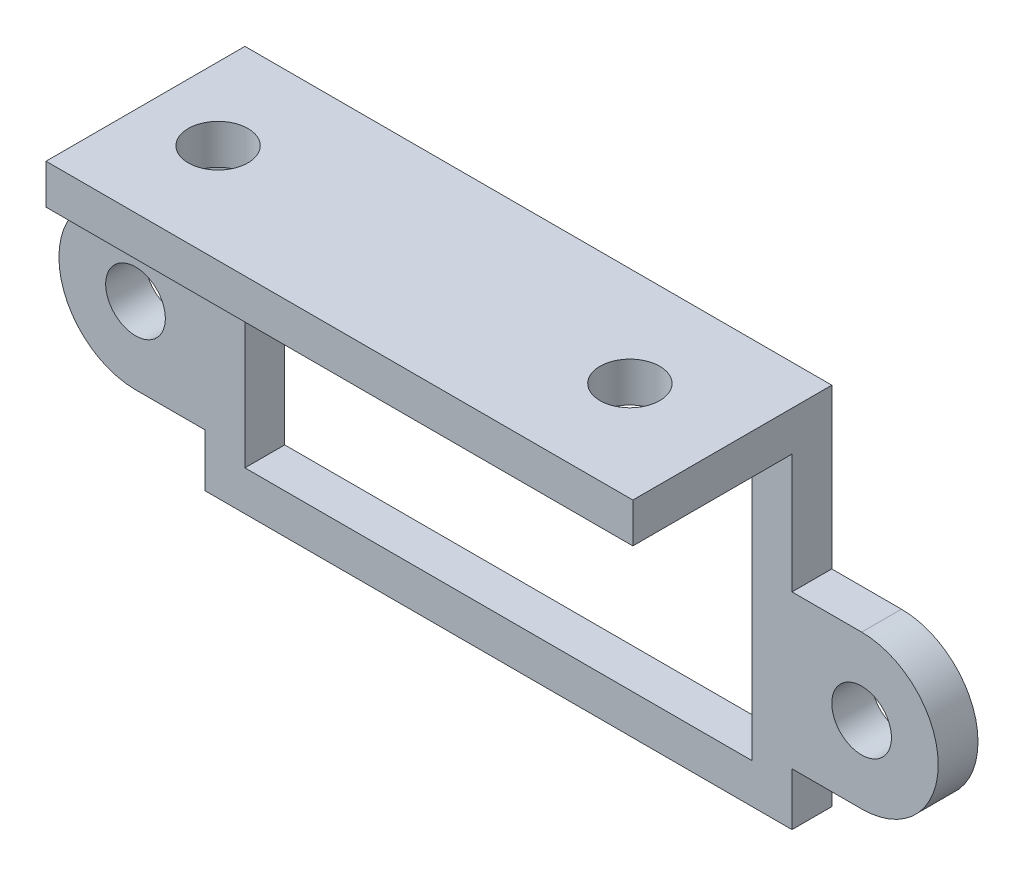
ISO-10303-21;
HEADER;
FILE_DESCRIPTION(('STEP AP214'),'2;1');
FILE_NAME('part.step','',(''),(''),'','','');
FILE_SCHEMA(('AUTOMOTIVE_DESIGN { 1 0 10303 214 1 1 1 1 }'));
ENDSEC;
DATA;
#1=APPLICATION_CONTEXT('core data for automotive mechanical design processes');
#2=APPLICATION_PROTOCOL_DEFINITION('international standard','automotive_design',2000,#1);
#3=PRODUCT_CONTEXT('',#1,'mechanical');
#4=PRODUCT('Part','Part','',(#3));
#5=PRODUCT_RELATED_PRODUCT_CATEGORY('part','',(#4));
#6=PRODUCT_DEFINITION_FORMATION('','',#4);
#7=PRODUCT_DEFINITION_CONTEXT('part definition',#1,'design');
#8=PRODUCT_DEFINITION('design','',#6,#7);
#9=PRODUCT_DEFINITION_SHAPE('','',#8);
#10=(LENGTH_UNIT() NAMED_UNIT(*) SI_UNIT(.MILLI.,.METRE.));
#11=(NAMED_UNIT(*) PLANE_ANGLE_UNIT() SI_UNIT($,.RADIAN.));
#12=(NAMED_UNIT(*) SI_UNIT($,.STERADIAN.) SOLID_ANGLE_UNIT());
#13=UNCERTAINTY_MEASURE_WITH_UNIT(LENGTH_MEASURE(1.E-05),#10,'distance_accuracy_value','');
#14=(GEOMETRIC_REPRESENTATION_CONTEXT(3) GLOBAL_UNCERTAINTY_ASSIGNED_CONTEXT((#13)) GLOBAL_UNIT_ASSIGNED_CONTEXT((#10,
#11,#12)) REPRESENTATION_CONTEXT('',''));
#15=CARTESIAN_POINT('',(0.,0.,0.));
#16=DIRECTION('',(0.,0.,1.));
#17=DIRECTION('',(1.,0.,0.));
#18=AXIS2_PLACEMENT_3D('',#15,#16,#17);
#19=CARTESIAN_POINT('',(33.,6.50000000000002,2.));
#20=DIRECTION('',(0.,0.,-1.));
#21=DIRECTION('',(-1.,0.,0.));
#22=AXIS2_PLACEMENT_3D('',#19,#20,#21);
#23=PLANE('',#22);
#24=CARTESIAN_POINT('',(-3.5,6.5,2.));
#25=DIRECTION('',(0.,0.,1.));
#26=DIRECTION('',(1.,0.,0.));
#27=AXIS2_PLACEMENT_3D('',#24,#25,#26);
#28=CIRCLE('',#27,1.5);
#29=CARTESIAN_POINT('',(-2.,6.5,2.));
#30=VERTEX_POINT('',#29);
#31=EDGE_CURVE('E260',#30,#30,#28,.T.);
#32=ORIENTED_EDGE('',*,*,#31,.F.);
#33=EDGE_LOOP('',(#32));
#34=FACE_BOUND('',#33,.T.);
#35=CARTESIAN_POINT('',(33.,6.50000000000002,2.));
#36=DIRECTION('',(0.,0.,1.));
#37=DIRECTION('',(-1.,0.,0.));
#38=AXIS2_PLACEMENT_3D('',#35,#36,#37);
#39=CIRCLE('',#38,1.5);
#40=CARTESIAN_POINT('',(31.5,6.50000000000002,2.));
#41=VERTEX_POINT('',#40);
#42=EDGE_CURVE('E254',#41,#41,#39,.T.);
#43=ORIENTED_EDGE('',*,*,#42,.F.);
#44=EDGE_LOOP('',(#43));
#45=FACE_BOUND('',#44,.T.);
#46=DIRECTION('',(1.,0.,0.));
#47=VECTOR('',#46,1.);
#48=CARTESIAN_POINT('',(0.,16.35,2.));
#49=LINE('',#48,#47);
#50=CARTESIAN_POINT('',(0.,16.35,2.));
#51=VERTEX_POINT('',#50);
#52=CARTESIAN_POINT('',(2.,16.35,2.));
#53=VERTEX_POINT('',#52);
#54=EDGE_CURVE('E52',#51,#53,#49,.T.);
#55=ORIENTED_EDGE('',*,*,#54,.F.);
#56=DIRECTION('',(0.,-1.,0.));
#57=VECTOR('',#56,1.);
#58=CARTESIAN_POINT('',(0.,18.35,2.));
#59=LINE('',#58,#57);
#60=CARTESIAN_POINT('',(0.,10.35,2.));
#61=VERTEX_POINT('',#60);
#62=EDGE_CURVE('E185',#51,#61,#59,.T.);
#63=ORIENTED_EDGE('',*,*,#62,.T.);
#64=DIRECTION('',(-1.,0.,0.));
#65=VECTOR('',#64,1.);
#66=CARTESIAN_POINT('',(0.,10.35,2.));
#67=LINE('',#66,#65);
#68=CARTESIAN_POINT('',(-3.5,10.35,2.));
#69=VERTEX_POINT('',#68);
#70=EDGE_CURVE('E345',#61,#69,#67,.T.);
#71=ORIENTED_EDGE('',*,*,#70,.T.);
#72=CARTESIAN_POINT('',(-3.5,6.5,2.));
#73=DIRECTION('',(0.,0.,1.));
#74=DIRECTION('',(1.,0.,0.));
#75=AXIS2_PLACEMENT_3D('',#72,#73,#74);
#76=CIRCLE('',#75,3.85);
#77=CARTESIAN_POINT('',(-3.5,2.65,2.));
#78=VERTEX_POINT('',#77);
#79=EDGE_CURVE('E344',#69,#78,#76,.T.);
#80=ORIENTED_EDGE('',*,*,#79,.T.);
#81=DIRECTION('',(1.,0.,0.));
#82=VECTOR('',#81,1.);
#83=CARTESIAN_POINT('',(0.,2.65,2.));
#84=LINE('',#83,#82);
#85=CARTESIAN_POINT('',(0.,2.65,2.));
#86=VERTEX_POINT('',#85);
#87=EDGE_CURVE('E319',#78,#86,#84,.T.);
#88=ORIENTED_EDGE('',*,*,#87,.T.);
#89=DIRECTION('',(0.,-1.,0.));
#90=VECTOR('',#89,1.);
#91=CARTESIAN_POINT('',(0.,2.65,2.));
#92=LINE('',#91,#90);
#93=CARTESIAN_POINT('',(0.,0.,2.));
#94=VERTEX_POINT('',#93);
#95=EDGE_CURVE('E266',#86,#94,#92,.T.);
#96=ORIENTED_EDGE('',*,*,#95,.T.);
#97=DIRECTION('',(1.,0.,0.));
#98=VECTOR('',#97,1.);
#99=CARTESIAN_POINT('',(0.,0.,2.));
#100=LINE('',#99,#98);
#101=CARTESIAN_POINT('',(29.5,0.,2.));
#102=VERTEX_POINT('',#101);
#103=EDGE_CURVE('E269',#94,#102,#100,.T.);
#104=ORIENTED_EDGE('',*,*,#103,.T.);
#105=DIRECTION('',(0.,1.,0.));
#106=VECTOR('',#105,1.);
#107=CARTESIAN_POINT('',(29.5,2.65000000000002,2.));
#108=LINE('',#107,#106);
#109=CARTESIAN_POINT('',(29.5,2.65000000000002,2.));
#110=VERTEX_POINT('',#109);
#111=EDGE_CURVE('E272',#102,#110,#108,.T.);
#112=ORIENTED_EDGE('',*,*,#111,.T.);
#113=DIRECTION('',(1.,0.,0.));
#114=VECTOR('',#113,1.);
#115=CARTESIAN_POINT('',(29.5,2.65000000000002,2.));
#116=LINE('',#115,#114);
#117=CARTESIAN_POINT('',(33.,2.65000000000003,2.));
#118=VERTEX_POINT('',#117);
#119=EDGE_CURVE('E274',#110,#118,#116,.T.);
#120=ORIENTED_EDGE('',*,*,#119,.T.);
#121=CARTESIAN_POINT('',(33.,6.50000000000002,2.));
#122=DIRECTION('',(0.,0.,1.));
#123=DIRECTION('',(-1.,0.,0.));
#124=AXIS2_PLACEMENT_3D('',#121,#122,#123);
#125=CIRCLE('',#124,3.85);
#126=CARTESIAN_POINT('',(33.,10.35,2.));
#127=VERTEX_POINT('',#126);
#128=EDGE_CURVE('E276',#118,#127,#125,.T.);
#129=ORIENTED_EDGE('',*,*,#128,.T.);
#130=DIRECTION('',(-1.,0.,0.));
#131=VECTOR('',#130,1.);
#132=CARTESIAN_POINT('',(29.5,10.35,2.));
#133=LINE('',#132,#131);
#134=CARTESIAN_POINT('',(29.5,10.35,2.));
#135=VERTEX_POINT('',#134);
#136=EDGE_CURVE('E278',#127,#135,#133,.T.);
#137=ORIENTED_EDGE('',*,*,#136,.T.);
#138=DIRECTION('',(0.,1.,0.));
#139=VECTOR('',#138,1.);
#140=CARTESIAN_POINT('',(29.5,18.35,2.));
#141=LINE('',#140,#139);
#142=CARTESIAN_POINT('',(29.5,16.35,2.));
#143=VERTEX_POINT('',#142);
#144=EDGE_CURVE('E280',#135,#143,#141,.T.);
#145=ORIENTED_EDGE('',*,*,#144,.T.);
#146=CARTESIAN_POINT('',(27.5,16.35,2.));
#147=VERTEX_POINT('',#146);
#148=EDGE_CURVE('E11',#147,#143,#49,.T.);
#149=ORIENTED_EDGE('',*,*,#148,.F.);
#150=DIRECTION('',(0.,1.,0.));
#151=VECTOR('',#150,1.);
#152=CARTESIAN_POINT('',(27.5,2.,2.));
#153=LINE('',#152,#151);
#154=CARTESIAN_POINT('',(27.5,2.,2.));
#155=VERTEX_POINT('',#154);
#156=EDGE_CURVE('E228',#155,#147,#153,.T.);
#157=ORIENTED_EDGE('',*,*,#156,.F.);
#158=DIRECTION('',(1.,0.,0.));
#159=VECTOR('',#158,1.);
#160=CARTESIAN_POINT('',(2.,2.,2.));
#161=LINE('',#160,#159);
#162=CARTESIAN_POINT('',(2.,2.,2.));
#163=VERTEX_POINT('',#162);
#164=EDGE_CURVE('E231',#163,#155,#161,.T.);
#165=ORIENTED_EDGE('',*,*,#164,.F.);
#166=DIRECTION('',(0.,-1.,0.));
#167=VECTOR('',#166,1.);
#168=CARTESIAN_POINT('',(2.,2.,2.));
#169=LINE('',#168,#167);
#170=EDGE_CURVE('E237',#53,#163,#169,.T.);
#171=ORIENTED_EDGE('',*,*,#170,.F.);
#172=EDGE_LOOP('',(#55,#63,#71,#80,#88,#96,#104,#112,#120,#129,#137,#145,#149,#157,#165,#171));
#173=FACE_BOUND('',#172,.T.);
#174=ADVANCED_FACE('F35',(#34,#45,#173),#23,.F.);
#175=CARTESIAN_POINT('',(33.,6.50000000000002,0.));
#176=DIRECTION('',(0.,0.,-1.));
#177=DIRECTION('',(-1.,0.,0.));
#178=AXIS2_PLACEMENT_3D('',#175,#176,#177);
#179=PLANE('',#178);
#180=CARTESIAN_POINT('',(33.,6.50000000000002,0.));
#181=DIRECTION('',(0.,0.,1.));
#182=DIRECTION('',(-1.,0.,0.));
#183=AXIS2_PLACEMENT_3D('',#180,#181,#182);
#184=CIRCLE('',#183,1.5);
#185=CARTESIAN_POINT('',(31.5,6.50000000000002,0.));
#186=VERTEX_POINT('',#185);
#187=EDGE_CURVE('E253',#186,#186,#184,.T.);
#188=ORIENTED_EDGE('',*,*,#187,.T.);
#189=EDGE_LOOP('',(#188));
#190=FACE_BOUND('',#189,.T.);
#191=DIRECTION('',(0.,-1.,0.));
#192=VECTOR('',#191,1.);
#193=CARTESIAN_POINT('',(0.,2.65,0.));
#194=LINE('',#193,#192);
#195=CARTESIAN_POINT('',(0.,2.65,0.));
#196=VERTEX_POINT('',#195);
#197=CARTESIAN_POINT('',(0.,0.,0.));
#198=VERTEX_POINT('',#197);
#199=EDGE_CURVE('E263',#196,#198,#194,.T.);
#200=ORIENTED_EDGE('',*,*,#199,.F.);
#201=DIRECTION('',(1.,0.,0.));
#202=VECTOR('',#201,1.);
#203=CARTESIAN_POINT('',(0.,2.65,0.));
#204=LINE('',#203,#202);
#205=CARTESIAN_POINT('',(-3.5,2.65,0.));
#206=VERTEX_POINT('',#205);
#207=EDGE_CURVE('E270',#206,#196,#204,.T.);
#208=ORIENTED_EDGE('',*,*,#207,.F.);
#209=CARTESIAN_POINT('',(-3.5,6.5,0.));
#210=DIRECTION('',(0.,0.,1.));
#211=DIRECTION('',(1.,0.,0.));
#212=AXIS2_PLACEMENT_3D('',#209,#210,#211);
#213=CIRCLE('',#212,3.85);
#214=CARTESIAN_POINT('',(-3.5,10.35,0.));
#215=VERTEX_POINT('',#214);
#216=EDGE_CURVE('E321',#215,#206,#213,.T.);
#217=ORIENTED_EDGE('',*,*,#216,.F.);
#218=DIRECTION('',(-1.,0.,0.));
#219=VECTOR('',#218,1.);
#220=CARTESIAN_POINT('',(0.,10.35,0.));
#221=LINE('',#220,#219);
#222=CARTESIAN_POINT('',(0.,10.35,0.));
#223=VERTEX_POINT('',#222);
#224=EDGE_CURVE('E323',#223,#215,#221,.T.);
#225=ORIENTED_EDGE('',*,*,#224,.F.);
#226=DIRECTION('',(0.,-1.,0.));
#227=VECTOR('',#226,1.);
#228=CARTESIAN_POINT('',(0.,18.35,0.));
#229=LINE('',#228,#227);
#230=CARTESIAN_POINT('',(0.,18.35,0.));
#231=VERTEX_POINT('',#230);
#232=EDGE_CURVE('E325',#231,#223,#229,.T.);
#233=ORIENTED_EDGE('',*,*,#232,.F.);
#234=DIRECTION('',(-1.,0.,0.));
#235=VECTOR('',#234,1.);
#236=CARTESIAN_POINT('',(0.,18.35,0.));
#237=LINE('',#236,#235);
#238=CARTESIAN_POINT('',(29.5,18.35,0.));
#239=VERTEX_POINT('',#238);
#240=EDGE_CURVE('E327',#239,#231,#237,.T.);
#241=ORIENTED_EDGE('',*,*,#240,.F.);
#242=DIRECTION('',(0.,1.,0.));
#243=VECTOR('',#242,1.);
#244=CARTESIAN_POINT('',(29.5,18.35,0.));
#245=LINE('',#244,#243);
#246=CARTESIAN_POINT('',(29.5,10.35,0.));
#247=VERTEX_POINT('',#246);
#248=EDGE_CURVE('E329',#247,#239,#245,.T.);
#249=ORIENTED_EDGE('',*,*,#248,.F.);
#250=DIRECTION('',(-1.,0.,0.));
#251=VECTOR('',#250,1.);
#252=CARTESIAN_POINT('',(29.5,10.35,0.));
#253=LINE('',#252,#251);
#254=CARTESIAN_POINT('',(33.,10.35,0.));
#255=VERTEX_POINT('',#254);
#256=EDGE_CURVE('E331',#255,#247,#253,.T.);
#257=ORIENTED_EDGE('',*,*,#256,.F.);
#258=CARTESIAN_POINT('',(33.,6.50000000000002,0.));
#259=DIRECTION('',(0.,0.,1.));
#260=DIRECTION('',(-1.,0.,0.));
#261=AXIS2_PLACEMENT_3D('',#258,#259,#260);
#262=CIRCLE('',#261,3.85);
#263=CARTESIAN_POINT('',(33.,2.65000000000003,0.));
#264=VERTEX_POINT('',#263);
#265=EDGE_CURVE('E333',#264,#255,#262,.T.);
#266=ORIENTED_EDGE('',*,*,#265,.F.);
#267=DIRECTION('',(1.,0.,0.));
#268=VECTOR('',#267,1.);
#269=CARTESIAN_POINT('',(29.5,2.65000000000002,0.));
#270=LINE('',#269,#268);
#271=CARTESIAN_POINT('',(29.5,2.65000000000002,0.));
#272=VERTEX_POINT('',#271);
#273=EDGE_CURVE('E335',#272,#264,#270,.T.);
#274=ORIENTED_EDGE('',*,*,#273,.F.);
#275=DIRECTION('',(0.,1.,0.));
#276=VECTOR('',#275,1.);
#277=CARTESIAN_POINT('',(29.5,2.65000000000002,0.));
#278=LINE('',#277,#276);
#279=CARTESIAN_POINT('',(29.5,0.,0.));
#280=VERTEX_POINT('',#279);
#281=EDGE_CURVE('E337',#280,#272,#278,.T.);
#282=ORIENTED_EDGE('',*,*,#281,.F.);
#283=DIRECTION('',(1.,0.,0.));
#284=VECTOR('',#283,1.);
#285=CARTESIAN_POINT('',(0.,0.,0.));
#286=LINE('',#285,#284);
#287=EDGE_CURVE('E339',#198,#280,#286,.T.);
#288=ORIENTED_EDGE('',*,*,#287,.F.);
#289=EDGE_LOOP('',(#200,#208,#217,#225,#233,#241,#249,#257,#266,#274,#282,#288));
#290=FACE_BOUND('',#289,.T.);
#291=CARTESIAN_POINT('',(-3.5,6.5,0.));
#292=DIRECTION('',(0.,0.,1.));
#293=DIRECTION('',(1.,0.,0.));
#294=AXIS2_PLACEMENT_3D('',#291,#292,#293);
#295=CIRCLE('',#294,1.5);
#296=CARTESIAN_POINT('',(-2.,6.5,0.));
#297=VERTEX_POINT('',#296);
#298=EDGE_CURVE('E257',#297,#297,#295,.T.);
#299=ORIENTED_EDGE('',*,*,#298,.T.);
#300=EDGE_LOOP('',(#299));
#301=FACE_BOUND('',#300,.T.);
#302=DIRECTION('',(-1.,0.,0.));
#303=VECTOR('',#302,1.);
#304=CARTESIAN_POINT('',(2.,16.35,0.));
#305=LINE('',#304,#303);
#306=CARTESIAN_POINT('',(27.5,16.35,0.));
#307=VERTEX_POINT('',#306);
#308=CARTESIAN_POINT('',(2.,16.35,0.));
#309=VERTEX_POINT('',#308);
#310=EDGE_CURVE('E238',#307,#309,#305,.T.);
#311=ORIENTED_EDGE('',*,*,#310,.T.);
#312=DIRECTION('',(0.,-1.,0.));
#313=VECTOR('',#312,1.);
#314=CARTESIAN_POINT('',(2.,2.,0.));
#315=LINE('',#314,#313);
#316=CARTESIAN_POINT('',(2.,2.,0.));
#317=VERTEX_POINT('',#316);
#318=EDGE_CURVE('E186',#309,#317,#315,.T.);
#319=ORIENTED_EDGE('',*,*,#318,.T.);
#320=DIRECTION('',(1.,0.,0.));
#321=VECTOR('',#320,1.);
#322=CARTESIAN_POINT('',(2.,2.,0.));
#323=LINE('',#322,#321);
#324=CARTESIAN_POINT('',(27.5,2.,0.));
#325=VERTEX_POINT('',#324);
#326=EDGE_CURVE('E189',#317,#325,#323,.T.);
#327=ORIENTED_EDGE('',*,*,#326,.T.);
#328=DIRECTION('',(0.,1.,0.));
#329=VECTOR('',#328,1.);
#330=CARTESIAN_POINT('',(27.5,2.,0.));
#331=LINE('',#330,#329);
#332=EDGE_CURVE('E243',#325,#307,#331,.T.);
#333=ORIENTED_EDGE('',*,*,#332,.T.);
#334=EDGE_LOOP('',(#311,#319,#327,#333));
#335=FACE_BOUND('',#334,.T.);
#336=ADVANCED_FACE('F397',(#190,#290,#301,#335),#179,.T.);
#337=CARTESIAN_POINT('',(0.,2.65,2.));
#338=DIRECTION('',(1.,0.,0.));
#339=DIRECTION('',(0.,0.,-1.));
#340=AXIS2_PLACEMENT_3D('',#337,#338,#339);
#341=PLANE('',#340);
#342=ORIENTED_EDGE('',*,*,#199,.T.);
#343=DIRECTION('',(0.,0.,-1.));
#344=VECTOR('',#343,1.);
#345=CARTESIAN_POINT('',(0.,0.,2.));
#346=LINE('',#345,#344);
#347=EDGE_CURVE('E44',#94,#198,#346,.T.);
#348=ORIENTED_EDGE('',*,*,#347,.F.);
#349=ORIENTED_EDGE('',*,*,#95,.F.);
#350=DIRECTION('',(0.,0.,-1.));
#351=VECTOR('',#350,1.);
#352=CARTESIAN_POINT('',(0.,2.65,2.));
#353=LINE('',#352,#351);
#354=EDGE_CURVE('E316',#86,#196,#353,.T.);
#355=ORIENTED_EDGE('',*,*,#354,.T.);
#356=EDGE_LOOP('',(#342,#348,#349,#355));
#357=FACE_BOUND('',#356,.T.);
#358=ADVANCED_FACE('F37',(#357),#341,.F.);
#359=CARTESIAN_POINT('',(0.,0.,2.));
#360=DIRECTION('',(0.,1.,0.));
#361=DIRECTION('',(-1.,0.,0.));
#362=AXIS2_PLACEMENT_3D('',#359,#360,#361);
#363=PLANE('',#362);
#364=ORIENTED_EDGE('',*,*,#287,.T.);
#365=DIRECTION('',(0.,0.,-1.));
#366=VECTOR('',#365,1.);
#367=CARTESIAN_POINT('',(29.5,0.,2.));
#368=LINE('',#367,#366);
#369=EDGE_CURVE('E287',#102,#280,#368,.T.);
#370=ORIENTED_EDGE('',*,*,#369,.F.);
#371=ORIENTED_EDGE('',*,*,#103,.F.);
#372=ORIENTED_EDGE('',*,*,#347,.T.);
#373=EDGE_LOOP('',(#364,#370,#371,#372));
#374=FACE_BOUND('',#373,.T.);
#375=ADVANCED_FACE('F367',(#374),#363,.F.);
#376=CARTESIAN_POINT('',(29.5,2.65000000000002,2.));
#377=DIRECTION('',(-1.,0.,0.));
#378=DIRECTION('',(0.,-1.,0.));
#379=AXIS2_PLACEMENT_3D('',#376,#377,#378);
#380=PLANE('',#379);
#381=ORIENTED_EDGE('',*,*,#281,.T.);
#382=DIRECTION('',(0.,0.,-1.));
#383=VECTOR('',#382,1.);
#384=CARTESIAN_POINT('',(29.5,2.65000000000002,2.));
#385=LINE('',#384,#383);
#386=EDGE_CURVE('E290',#110,#272,#385,.T.);
#387=ORIENTED_EDGE('',*,*,#386,.F.);
#388=ORIENTED_EDGE('',*,*,#111,.F.);
#389=ORIENTED_EDGE('',*,*,#369,.T.);
#390=EDGE_LOOP('',(#381,#387,#388,#389));
#391=FACE_BOUND('',#390,.T.);
#392=ADVANCED_FACE('F374',(#391),#380,.F.);
#393=CARTESIAN_POINT('',(29.5,2.65000000000002,2.));
#394=DIRECTION('',(0.,1.,0.));
#395=DIRECTION('',(-1.,0.,0.));
#396=AXIS2_PLACEMENT_3D('',#393,#394,#395);
#397=PLANE('',#396);
#398=ORIENTED_EDGE('',*,*,#273,.T.);
#399=DIRECTION('',(0.,0.,-1.));
#400=VECTOR('',#399,1.);
#401=CARTESIAN_POINT('',(33.,2.65000000000003,2.));
#402=LINE('',#401,#400);
#403=EDGE_CURVE('E293',#118,#264,#402,.T.);
#404=ORIENTED_EDGE('',*,*,#403,.F.);
#405=ORIENTED_EDGE('',*,*,#119,.F.);
#406=ORIENTED_EDGE('',*,*,#386,.T.);
#407=EDGE_LOOP('',(#398,#404,#405,#406));
#408=FACE_BOUND('',#407,.T.);
#409=ADVANCED_FACE('F378',(#408),#397,.F.);
#410=CARTESIAN_POINT('',(33.,6.50000000000002,2.));
#411=DIRECTION('',(0.,0.,-1.));
#412=DIRECTION('',(-1.,0.,0.));
#413=AXIS2_PLACEMENT_3D('',#410,#411,#412);
#414=CYLINDRICAL_SURFACE('',#413,3.85);
#415=ORIENTED_EDGE('',*,*,#265,.T.);
#416=DIRECTION('',(0.,0.,-1.));
#417=VECTOR('',#416,1.);
#418=CARTESIAN_POINT('',(33.,10.35,2.));
#419=LINE('',#418,#417);
#420=EDGE_CURVE('E296',#127,#255,#419,.T.);
#421=ORIENTED_EDGE('',*,*,#420,.F.);
#422=ORIENTED_EDGE('',*,*,#128,.F.);
#423=ORIENTED_EDGE('',*,*,#403,.T.);
#424=EDGE_LOOP('',(#415,#421,#422,#423));
#425=FACE_BOUND('',#424,.T.);
#426=ADVANCED_FACE('F383',(#425),#414,.T.);
#427=CARTESIAN_POINT('',(29.5,10.35,2.));
#428=DIRECTION('',(0.,-1.,0.));
#429=DIRECTION('',(1.,0.,0.));
#430=AXIS2_PLACEMENT_3D('',#427,#428,#429);
#431=PLANE('',#430);
#432=ORIENTED_EDGE('',*,*,#256,.T.);
#433=DIRECTION('',(0.,0.,-1.));
#434=VECTOR('',#433,1.);
#435=CARTESIAN_POINT('',(29.5,10.35,2.));
#436=LINE('',#435,#434);
#437=EDGE_CURVE('E299',#135,#247,#436,.T.);
#438=ORIENTED_EDGE('',*,*,#437,.F.);
#439=ORIENTED_EDGE('',*,*,#136,.F.);
#440=ORIENTED_EDGE('',*,*,#420,.T.);
#441=EDGE_LOOP('',(#432,#438,#439,#440));
#442=FACE_BOUND('',#441,.T.);
#443=ADVANCED_FACE('F388',(#442),#431,.F.);
#444=CARTESIAN_POINT('',(29.5,18.35,2.));
#445=DIRECTION('',(-1.,0.,0.));
#446=DIRECTION('',(0.,-1.,0.));
#447=AXIS2_PLACEMENT_3D('',#444,#445,#446);
#448=PLANE('',#447);
#449=ORIENTED_EDGE('',*,*,#248,.T.);
#450=DIRECTION('',(0.,0.,-1.));
#451=VECTOR('',#450,1.);
#452=CARTESIAN_POINT('',(29.5,18.35,2.));
#453=LINE('',#452,#451);
#454=CARTESIAN_POINT('',(29.5,18.35,10.));
#455=VERTEX_POINT('',#454);
#456=EDGE_CURVE('E302',#455,#239,#453,.T.);
#457=ORIENTED_EDGE('',*,*,#456,.F.);
#458=DIRECTION('',(0.,1.,0.));
#459=VECTOR('',#458,1.);
#460=CARTESIAN_POINT('',(29.5,18.35,10.));
#461=LINE('',#460,#459);
#462=CARTESIAN_POINT('',(29.5,16.35,10.));
#463=VERTEX_POINT('',#462);
#464=EDGE_CURVE('E172',#463,#455,#461,.T.);
#465=ORIENTED_EDGE('',*,*,#464,.F.);
#466=DIRECTION('',(0.,0.,-1.));
#467=VECTOR('',#466,1.);
#468=CARTESIAN_POINT('',(29.5,16.35,10.));
#469=LINE('',#468,#467);
#470=EDGE_CURVE('E168',#463,#143,#469,.T.);
#471=ORIENTED_EDGE('',*,*,#470,.T.);
#472=ORIENTED_EDGE('',*,*,#144,.F.);
#473=ORIENTED_EDGE('',*,*,#437,.T.);
#474=EDGE_LOOP('',(#449,#457,#465,#471,#472,#473));
#475=FACE_BOUND('',#474,.T.);
#476=ADVANCED_FACE('F392',(#475),#448,.F.);
#477=CARTESIAN_POINT('',(0.,18.35,2.));
#478=DIRECTION('',(0.,-1.,0.));
#479=DIRECTION('',(1.,0.,0.));
#480=AXIS2_PLACEMENT_3D('',#477,#478,#479);
#481=PLANE('',#480);
#482=CARTESIAN_POINT('',(24.35,18.35,5.));
#483=DIRECTION('',(0.,1.,0.));
#484=DIRECTION('',(-1.,0.,0.));
#485=AXIS2_PLACEMENT_3D('',#482,#483,#484);
#486=CIRCLE('',#485,1.5);
#487=CARTESIAN_POINT('',(22.85,18.35,5.));
#488=VERTEX_POINT('',#487);
#489=EDGE_CURVE('E208',#488,#488,#486,.T.);
#490=ORIENTED_EDGE('',*,*,#489,.F.);
#491=EDGE_LOOP('',(#490));
#492=FACE_BOUND('',#491,.T.);
#493=CARTESIAN_POINT('',(3.65,18.35,5.));
#494=DIRECTION('',(0.,1.,0.));
#495=DIRECTION('',(-1.,0.,0.));
#496=AXIS2_PLACEMENT_3D('',#493,#494,#495);
#497=CIRCLE('',#496,1.5);
#498=CARTESIAN_POINT('',(2.15,18.35,5.));
#499=VERTEX_POINT('',#498);
#500=EDGE_CURVE('E199',#499,#499,#497,.T.);
#501=ORIENTED_EDGE('',*,*,#500,.F.);
#502=EDGE_LOOP('',(#501));
#503=FACE_BOUND('',#502,.T.);
#504=ORIENTED_EDGE('',*,*,#240,.T.);
#505=DIRECTION('',(0.,0.,-1.));
#506=VECTOR('',#505,1.);
#507=CARTESIAN_POINT('',(0.,18.35,2.));
#508=LINE('',#507,#506);
#509=CARTESIAN_POINT('',(0.,18.35,10.));
#510=VERTEX_POINT('',#509);
#511=EDGE_CURVE('E305',#510,#231,#508,.T.);
#512=ORIENTED_EDGE('',*,*,#511,.F.);
#513=DIRECTION('',(-1.,0.,0.));
#514=VECTOR('',#513,1.);
#515=CARTESIAN_POINT('',(0.,18.35,10.));
#516=LINE('',#515,#514);
#517=EDGE_CURVE('E179',#455,#510,#516,.T.);
#518=ORIENTED_EDGE('',*,*,#517,.F.);
#519=ORIENTED_EDGE('',*,*,#456,.T.);
#520=EDGE_LOOP('',(#504,#512,#518,#519));
#521=FACE_BOUND('',#520,.T.);
#522=ADVANCED_FACE('F394',(#492,#503,#521),#481,.F.);
#523=CARTESIAN_POINT('',(0.,18.35,2.));
#524=DIRECTION('',(1.,0.,0.));
#525=DIRECTION('',(0.,1.,0.));
#526=AXIS2_PLACEMENT_3D('',#523,#524,#525);
#527=PLANE('',#526);
#528=ORIENTED_EDGE('',*,*,#232,.T.);
#529=DIRECTION('',(0.,0.,-1.));
#530=VECTOR('',#529,1.);
#531=CARTESIAN_POINT('',(0.,10.35,2.));
#532=LINE('',#531,#530);
#533=EDGE_CURVE('E307',#61,#223,#532,.T.);
#534=ORIENTED_EDGE('',*,*,#533,.F.);
#535=ORIENTED_EDGE('',*,*,#62,.F.);
#536=DIRECTION('',(0.,0.,-1.));
#537=VECTOR('',#536,1.);
#538=CARTESIAN_POINT('',(0.,16.35,10.));
#539=LINE('',#538,#537);
#540=CARTESIAN_POINT('',(0.,16.35,10.));
#541=VERTEX_POINT('',#540);
#542=EDGE_CURVE('E166',#541,#51,#539,.T.);
#543=ORIENTED_EDGE('',*,*,#542,.F.);
#544=DIRECTION('',(0.,-1.,0.));
#545=VECTOR('',#544,1.);
#546=CARTESIAN_POINT('',(0.,18.35,10.));
#547=LINE('',#546,#545);
#548=EDGE_CURVE('E173',#510,#541,#547,.T.);
#549=ORIENTED_EDGE('',*,*,#548,.F.);
#550=ORIENTED_EDGE('',*,*,#511,.T.);
#551=EDGE_LOOP('',(#528,#534,#535,#543,#549,#550));
#552=FACE_BOUND('',#551,.T.);
#553=ADVANCED_FACE('F183',(#552),#527,.F.);
#554=CARTESIAN_POINT('',(0.,10.35,2.));
#555=DIRECTION('',(0.,-1.,0.));
#556=DIRECTION('',(1.,0.,0.));
#557=AXIS2_PLACEMENT_3D('',#554,#555,#556);
#558=PLANE('',#557);
#559=ORIENTED_EDGE('',*,*,#224,.T.);
#560=DIRECTION('',(0.,0.,-1.));
#561=VECTOR('',#560,1.);
#562=CARTESIAN_POINT('',(-3.5,10.35,2.));
#563=LINE('',#562,#561);
#564=EDGE_CURVE('E310',#69,#215,#563,.T.);
#565=ORIENTED_EDGE('',*,*,#564,.F.);
#566=ORIENTED_EDGE('',*,*,#70,.F.);
#567=ORIENTED_EDGE('',*,*,#533,.T.);
#568=EDGE_LOOP('',(#559,#565,#566,#567));
#569=FACE_BOUND('',#568,.T.);
#570=ADVANCED_FACE('F351',(#569),#558,.F.);
#571=CARTESIAN_POINT('',(-3.5,6.5,2.));
#572=DIRECTION('',(0.,0.,-1.));
#573=DIRECTION('',(-1.,0.,0.));
#574=AXIS2_PLACEMENT_3D('',#571,#572,#573);
#575=CYLINDRICAL_SURFACE('',#574,3.85);
#576=ORIENTED_EDGE('',*,*,#216,.T.);
#577=DIRECTION('',(0.,0.,-1.));
#578=VECTOR('',#577,1.);
#579=CARTESIAN_POINT('',(-3.5,2.65,2.));
#580=LINE('',#579,#578);
#581=EDGE_CURVE('E313',#78,#206,#580,.T.);
#582=ORIENTED_EDGE('',*,*,#581,.F.);
#583=ORIENTED_EDGE('',*,*,#79,.F.);
#584=ORIENTED_EDGE('',*,*,#564,.T.);
#585=EDGE_LOOP('',(#576,#582,#583,#584));
#586=FACE_BOUND('',#585,.T.);
#587=ADVANCED_FACE('F356',(#586),#575,.T.);
#588=CARTESIAN_POINT('',(0.,2.65,2.));
#589=DIRECTION('',(0.,1.,0.));
#590=DIRECTION('',(-1.,0.,0.));
#591=AXIS2_PLACEMENT_3D('',#588,#589,#590);
#592=PLANE('',#591);
#593=ORIENTED_EDGE('',*,*,#207,.T.);
#594=ORIENTED_EDGE('',*,*,#354,.F.);
#595=ORIENTED_EDGE('',*,*,#87,.F.);
#596=ORIENTED_EDGE('',*,*,#581,.T.);
#597=EDGE_LOOP('',(#593,#594,#595,#596));
#598=FACE_BOUND('',#597,.T.);
#599=ADVANCED_FACE('F362',(#598),#592,.F.);
#600=CARTESIAN_POINT('',(-3.5,6.5,2.));
#601=DIRECTION('',(0.,0.,-1.));
#602=DIRECTION('',(-1.,0.,0.));
#603=AXIS2_PLACEMENT_3D('',#600,#601,#602);
#604=CYLINDRICAL_SURFACE('',#603,1.5);
#605=ORIENTED_EDGE('',*,*,#31,.T.);
#606=EDGE_LOOP('',(#605));
#607=FACE_BOUND('',#606,.T.);
#608=ORIENTED_EDGE('',*,*,#298,.F.);
#609=EDGE_LOOP('',(#608));
#610=FACE_BOUND('',#609,.T.);
#611=ADVANCED_FACE('F404',(#607,#610),#604,.F.);
#612=CARTESIAN_POINT('',(33.,6.50000000000002,2.));
#613=DIRECTION('',(0.,0.,-1.));
#614=DIRECTION('',(-1.,0.,0.));
#615=AXIS2_PLACEMENT_3D('',#612,#613,#614);
#616=CYLINDRICAL_SURFACE('',#615,1.5);
#617=ORIENTED_EDGE('',*,*,#42,.T.);
#618=EDGE_LOOP('',(#617));
#619=FACE_BOUND('',#618,.T.);
#620=ORIENTED_EDGE('',*,*,#187,.F.);
#621=EDGE_LOOP('',(#620));
#622=FACE_BOUND('',#621,.T.);
#623=ADVANCED_FACE('F406',(#619,#622),#616,.F.);
#624=CARTESIAN_POINT('',(2.,2.,2.));
#625=DIRECTION('',(1.,0.,0.));
#626=DIRECTION('',(0.,0.,-1.));
#627=AXIS2_PLACEMENT_3D('',#624,#625,#626);
#628=PLANE('',#627);
#629=ORIENTED_EDGE('',*,*,#318,.F.);
#630=DIRECTION('',(0.,0.,-1.));
#631=VECTOR('',#630,1.);
#632=CARTESIAN_POINT('',(2.,16.35,2.));
#633=LINE('',#632,#631);
#634=EDGE_CURVE('E225',#53,#309,#633,.T.);
#635=ORIENTED_EDGE('',*,*,#634,.F.);
#636=ORIENTED_EDGE('',*,*,#170,.T.);
#637=DIRECTION('',(0.,0.,-1.));
#638=VECTOR('',#637,1.);
#639=CARTESIAN_POINT('',(2.,2.,2.));
#640=LINE('',#639,#638);
#641=EDGE_CURVE('E251',#163,#317,#640,.T.);
#642=ORIENTED_EDGE('',*,*,#641,.T.);
#643=EDGE_LOOP('',(#629,#635,#636,#642));
#644=FACE_BOUND('',#643,.T.);
#645=ADVANCED_FACE('F413',(#644),#628,.T.);
#646=CARTESIAN_POINT('',(2.,2.,2.));
#647=DIRECTION('',(0.,1.,0.));
#648=DIRECTION('',(0.,0.,1.));
#649=AXIS2_PLACEMENT_3D('',#646,#647,#648);
#650=PLANE('',#649);
#651=ORIENTED_EDGE('',*,*,#326,.F.);
#652=ORIENTED_EDGE('',*,*,#641,.F.);
#653=ORIENTED_EDGE('',*,*,#164,.T.);
#654=DIRECTION('',(0.,0.,-1.));
#655=VECTOR('',#654,1.);
#656=CARTESIAN_POINT('',(27.5,2.,2.));
#657=LINE('',#656,#655);
#658=EDGE_CURVE('E224',#155,#325,#657,.T.);
#659=ORIENTED_EDGE('',*,*,#658,.T.);
#660=EDGE_LOOP('',(#651,#652,#653,#659));
#661=FACE_BOUND('',#660,.T.);
#662=ADVANCED_FACE('F537',(#661),#650,.T.);
#663=CARTESIAN_POINT('',(27.5,2.,2.));
#664=DIRECTION('',(-1.,0.,0.));
#665=DIRECTION('',(0.,0.,1.));
#666=AXIS2_PLACEMENT_3D('',#663,#664,#665);
#667=PLANE('',#666);
#668=ORIENTED_EDGE('',*,*,#332,.F.);
#669=ORIENTED_EDGE('',*,*,#658,.F.);
#670=ORIENTED_EDGE('',*,*,#156,.T.);
#671=DIRECTION('',(0.,0.,-1.));
#672=VECTOR('',#671,1.);
#673=CARTESIAN_POINT('',(27.5,16.35,2.));
#674=LINE('',#673,#672);
#675=EDGE_CURVE('E222',#147,#307,#674,.T.);
#676=ORIENTED_EDGE('',*,*,#675,.T.);
#677=EDGE_LOOP('',(#668,#669,#670,#676));
#678=FACE_BOUND('',#677,.T.);
#679=ADVANCED_FACE('F545',(#678),#667,.T.);
#680=CARTESIAN_POINT('',(2.,16.35,2.));
#681=DIRECTION('',(0.,-1.,0.));
#682=DIRECTION('',(0.,0.,-1.));
#683=AXIS2_PLACEMENT_3D('',#680,#681,#682);
#684=PLANE('',#683);
#685=CARTESIAN_POINT('',(24.35,16.35,5.));
#686=DIRECTION('',(0.,-1.,0.));
#687=DIRECTION('',(0.,0.,-1.));
#688=AXIS2_PLACEMENT_3D('',#685,#686,#687);
#689=CIRCLE('',#688,1.5);
#690=CARTESIAN_POINT('',(24.35,16.35,3.5));
#691=VERTEX_POINT('',#690);
#692=EDGE_CURVE('E39',#691,#691,#689,.T.);
#693=ORIENTED_EDGE('',*,*,#692,.F.);
#694=EDGE_LOOP('',(#693));
#695=FACE_BOUND('',#694,.T.);
#696=CARTESIAN_POINT('',(3.65,16.35,5.));
#697=DIRECTION('',(0.,-1.,0.));
#698=DIRECTION('',(0.,0.,-1.));
#699=AXIS2_PLACEMENT_3D('',#696,#697,#698);
#700=CIRCLE('',#699,1.5);
#701=CARTESIAN_POINT('',(3.65,16.35,3.5));
#702=VERTEX_POINT('',#701);
#703=EDGE_CURVE('E197',#702,#702,#700,.T.);
#704=ORIENTED_EDGE('',*,*,#703,.F.);
#705=EDGE_LOOP('',(#704));
#706=FACE_BOUND('',#705,.T.);
#707=ORIENTED_EDGE('',*,*,#310,.F.);
#708=ORIENTED_EDGE('',*,*,#675,.F.);
#709=ORIENTED_EDGE('',*,*,#148,.T.);
#710=ORIENTED_EDGE('',*,*,#470,.F.);
#711=DIRECTION('',(1.,0.,0.));
#712=VECTOR('',#711,1.);
#713=CARTESIAN_POINT('',(0.,16.35,10.));
#714=LINE('',#713,#712);
#715=EDGE_CURVE('E161',#541,#463,#714,.T.);
#716=ORIENTED_EDGE('',*,*,#715,.F.);
#717=ORIENTED_EDGE('',*,*,#542,.T.);
#718=ORIENTED_EDGE('',*,*,#54,.T.);
#719=ORIENTED_EDGE('',*,*,#634,.T.);
#720=EDGE_LOOP('',(#707,#708,#709,#710,#716,#717,#718,#719));
#721=FACE_BOUND('',#720,.T.);
#722=ADVANCED_FACE('F164',(#695,#706,#721),#684,.T.);
#723=CARTESIAN_POINT('',(0.,16.35,10.));
#724=DIRECTION('',(0.,0.,1.));
#725=DIRECTION('',(1.,0.,0.));
#726=AXIS2_PLACEMENT_3D('',#723,#724,#725);
#727=PLANE('',#726);
#728=ORIENTED_EDGE('',*,*,#548,.T.);
#729=ORIENTED_EDGE('',*,*,#715,.T.);
#730=ORIENTED_EDGE('',*,*,#464,.T.);
#731=ORIENTED_EDGE('',*,*,#517,.T.);
#732=EDGE_LOOP('',(#728,#729,#730,#731));
#733=FACE_BOUND('',#732,.T.);
#734=ADVANCED_FACE('F177',(#733),#727,.T.);
#735=CARTESIAN_POINT('',(3.65,10.35,5.));
#736=DIRECTION('',(0.,1.,0.));
#737=DIRECTION('',(-1.,0.,0.));
#738=AXIS2_PLACEMENT_3D('',#735,#736,#737);
#739=CYLINDRICAL_SURFACE('',#738,1.5);
#740=ORIENTED_EDGE('',*,*,#703,.T.);
#741=EDGE_LOOP('',(#740));
#742=FACE_BOUND('',#741,.T.);
#743=ORIENTED_EDGE('',*,*,#500,.T.);
#744=EDGE_LOOP('',(#743));
#745=FACE_BOUND('',#744,.T.);
#746=ADVANCED_FACE('F583',(#742,#745),#739,.F.);
#747=CARTESIAN_POINT('',(24.35,10.35,5.));
#748=DIRECTION('',(0.,1.,0.));
#749=DIRECTION('',(-1.,0.,0.));
#750=AXIS2_PLACEMENT_3D('',#747,#748,#749);
#751=CYLINDRICAL_SURFACE('',#750,1.5);
#752=ORIENTED_EDGE('',*,*,#692,.T.);
#753=EDGE_LOOP('',(#752));
#754=FACE_BOUND('',#753,.T.);
#755=ORIENTED_EDGE('',*,*,#489,.T.);
#756=EDGE_LOOP('',(#755));
#757=FACE_BOUND('',#756,.T.);
#758=ADVANCED_FACE('F588',(#754,#757),#751,.F.);
#759=CLOSED_SHELL('',(#174,#336,#358,#375,#392,#409,#426,#443,#476,#522,#553,#570,#587,#599,
#611,#623,#645,#662,#679,#722,#734,#746,#758));
#760=MANIFOLD_SOLID_BREP('B2',#759);
#761=ADVANCED_BREP_SHAPE_REPRESENTATION('',(#18,#760),#14);
#762=SHAPE_DEFINITION_REPRESENTATION(#9,#761);
ENDSEC;
END-ISO-10303-21;
